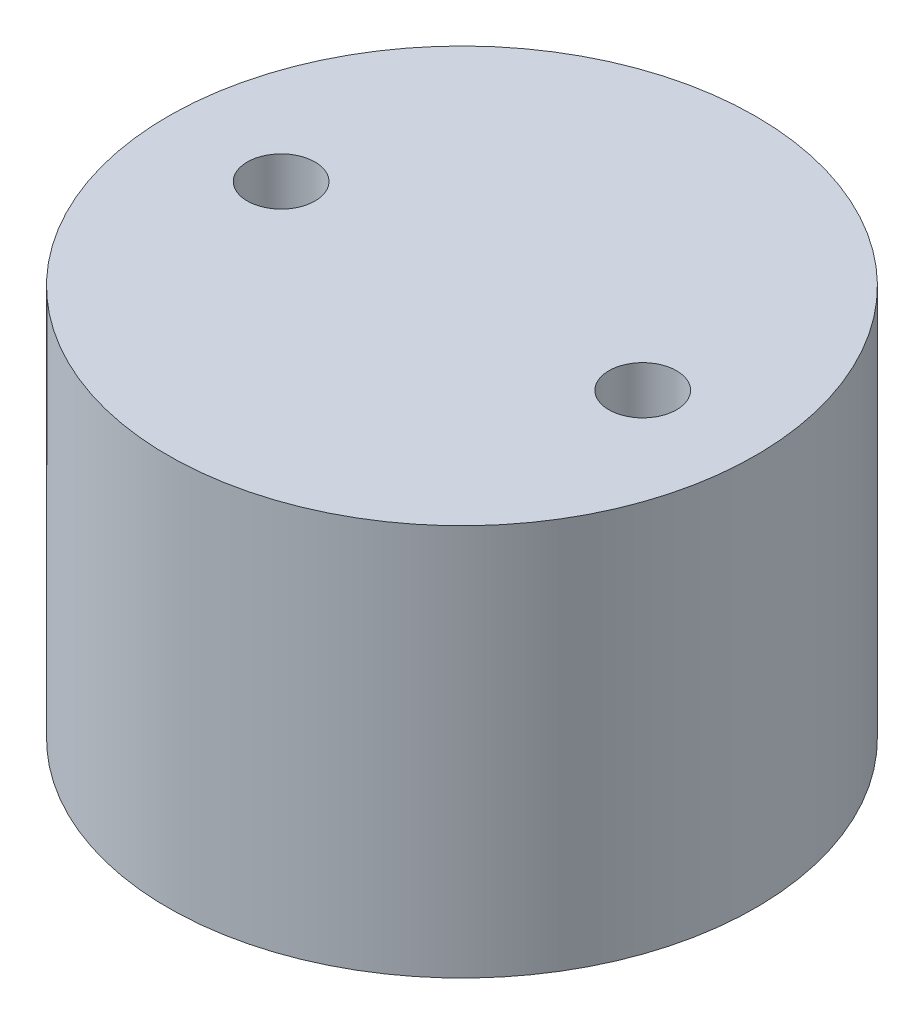
ISO-10303-21;
HEADER;
FILE_DESCRIPTION(('STEP AP214'),'2;1');
FILE_NAME('part.step','',(''),(''),'','','');
FILE_SCHEMA(('AUTOMOTIVE_DESIGN { 1 0 10303 214 1 1 1 1 }'));
ENDSEC;
DATA;
#1=APPLICATION_CONTEXT('core data for automotive mechanical design processes');
#2=APPLICATION_PROTOCOL_DEFINITION('international standard','automotive_design',2000,#1);
#3=PRODUCT_CONTEXT('',#1,'mechanical');
#4=PRODUCT('Part','Part','',(#3));
#5=PRODUCT_RELATED_PRODUCT_CATEGORY('part','',(#4));
#6=PRODUCT_DEFINITION_FORMATION('','',#4);
#7=PRODUCT_DEFINITION_CONTEXT('part definition',#1,'design');
#8=PRODUCT_DEFINITION('design','',#6,#7);
#9=PRODUCT_DEFINITION_SHAPE('','',#8);
#10=(LENGTH_UNIT() NAMED_UNIT(*) SI_UNIT(.MILLI.,.METRE.));
#11=(NAMED_UNIT(*) PLANE_ANGLE_UNIT() SI_UNIT($,.RADIAN.));
#12=(NAMED_UNIT(*) SI_UNIT($,.STERADIAN.) SOLID_ANGLE_UNIT());
#13=UNCERTAINTY_MEASURE_WITH_UNIT(LENGTH_MEASURE(1.E-05),#10,'distance_accuracy_value','');
#14=(GEOMETRIC_REPRESENTATION_CONTEXT(3) GLOBAL_UNCERTAINTY_ASSIGNED_CONTEXT((#13)) GLOBAL_UNIT_ASSIGNED_CONTEXT((#10,
#11,#12)) REPRESENTATION_CONTEXT('',''));
#15=CARTESIAN_POINT('',(0.,0.,0.));
#16=DIRECTION('',(0.,0.,1.));
#17=DIRECTION('',(1.,0.,0.));
#18=AXIS2_PLACEMENT_3D('',#15,#16,#17);
#19=CARTESIAN_POINT('',(0.,26.,0.));
#20=DIRECTION('',(0.,-1.,0.));
#21=DIRECTION('',(0.,0.,-1.));
#22=AXIS2_PLACEMENT_3D('',#19,#20,#21);
#23=CYLINDRICAL_SURFACE('',#22,19.5);
#24=CARTESIAN_POINT('',(0.,26.,0.));
#25=DIRECTION('',(0.,1.,0.));
#26=DIRECTION('',(0.,0.,1.));
#27=AXIS2_PLACEMENT_3D('',#24,#25,#26);
#28=CIRCLE('',#27,19.5);
#29=CARTESIAN_POINT('',(0.,26.,-19.5));
#30=VERTEX_POINT('',#29);
#31=EDGE_CURVE('E10',#30,#30,#28,.T.);
#32=CARTESIAN_POINT('',(0.,0.,0.));
#33=DIRECTION('',(0.,1.,0.));
#34=DIRECTION('',(0.,0.,1.));
#35=AXIS2_PLACEMENT_3D('',#32,#33,#34);
#36=CIRCLE('',#35,19.5);
#37=CARTESIAN_POINT('',(0.,0.,-19.5));
#38=VERTEX_POINT('',#37);
#39=EDGE_CURVE('E42',#38,#38,#36,.T.);
#40=CARTESIAN_POINT('',(0.,26.,-19.5));
#41=CARTESIAN_POINT('',(0.,25.7291666666667,-19.5));
#42=CARTESIAN_POINT('',(0.,25.4583333333333,-19.5));
#43=CARTESIAN_POINT('',(0.,24.9166666666667,-19.5));
#44=CARTESIAN_POINT('',(0.,24.6458333333333,-19.5));
#45=CARTESIAN_POINT('',(0.,24.1041666666667,-19.5));
#46=CARTESIAN_POINT('',(0.,23.8333333333333,-19.5));
#47=CARTESIAN_POINT('',(0.,23.2916666666667,-19.5));
#48=CARTESIAN_POINT('',(0.,23.0208333333333,-19.5));
#49=CARTESIAN_POINT('',(0.,22.4791666666667,-19.5));
#50=CARTESIAN_POINT('',(0.,22.2083333333333,-19.5));
#51=CARTESIAN_POINT('',(0.,21.6666666666667,-19.5));
#52=CARTESIAN_POINT('',(0.,21.3958333333333,-19.5));
#53=CARTESIAN_POINT('',(0.,20.8541666666667,-19.5));
#54=CARTESIAN_POINT('',(0.,20.5833333333333,-19.5));
#55=CARTESIAN_POINT('',(0.,20.0416666666667,-19.5));
#56=CARTESIAN_POINT('',(0.,19.7708333333333,-19.5));
#57=CARTESIAN_POINT('',(0.,19.2291666666667,-19.5));
#58=CARTESIAN_POINT('',(0.,18.9583333333333,-19.5));
#59=CARTESIAN_POINT('',(0.,18.4166666666667,-19.5));
#60=CARTESIAN_POINT('',(0.,18.1458333333333,-19.5));
#61=CARTESIAN_POINT('',(0.,17.6041666666667,-19.5));
#62=CARTESIAN_POINT('',(0.,17.3333333333333,-19.5));
#63=CARTESIAN_POINT('',(0.,16.7916666666667,-19.5));
#64=CARTESIAN_POINT('',(0.,16.5208333333333,-19.5));
#65=CARTESIAN_POINT('',(0.,15.9791666666667,-19.5));
#66=CARTESIAN_POINT('',(0.,15.7083333333333,-19.5));
#67=CARTESIAN_POINT('',(0.,15.1666666666667,-19.5));
#68=CARTESIAN_POINT('',(0.,14.8958333333333,-19.5));
#69=CARTESIAN_POINT('',(0.,14.3541666666667,-19.5));
#70=CARTESIAN_POINT('',(0.,14.0833333333333,-19.5));
#71=CARTESIAN_POINT('',(0.,13.5416666666667,-19.5));
#72=CARTESIAN_POINT('',(0.,13.2708333333333,-19.5));
#73=CARTESIAN_POINT('',(0.,12.7291666666667,-19.5));
#74=CARTESIAN_POINT('',(0.,12.4583333333333,-19.5));
#75=CARTESIAN_POINT('',(0.,11.9166666666667,-19.5));
#76=CARTESIAN_POINT('',(0.,11.6458333333333,-19.5));
#77=CARTESIAN_POINT('',(0.,11.1041666666667,-19.5));
#78=CARTESIAN_POINT('',(0.,10.8333333333333,-19.5));
#79=CARTESIAN_POINT('',(0.,10.2916666666667,-19.5));
#80=CARTESIAN_POINT('',(0.,10.0208333333333,-19.5));
#81=CARTESIAN_POINT('',(0.,9.47916666666667,-19.5));
#82=CARTESIAN_POINT('',(0.,9.20833333333333,-19.5));
#83=CARTESIAN_POINT('',(0.,8.66666666666667,-19.5));
#84=CARTESIAN_POINT('',(0.,8.39583333333333,-19.5));
#85=CARTESIAN_POINT('',(0.,7.85416666666667,-19.5));
#86=CARTESIAN_POINT('',(0.,7.58333333333333,-19.5));
#87=CARTESIAN_POINT('',(0.,7.04166666666667,-19.5));
#88=CARTESIAN_POINT('',(0.,6.77083333333333,-19.5));
#89=CARTESIAN_POINT('',(0.,6.22916666666667,-19.5));
#90=CARTESIAN_POINT('',(0.,5.95833333333333,-19.5));
#91=CARTESIAN_POINT('',(0.,5.41666666666667,-19.5));
#92=CARTESIAN_POINT('',(0.,5.14583333333333,-19.5));
#93=CARTESIAN_POINT('',(0.,4.60416666666667,-19.5));
#94=CARTESIAN_POINT('',(0.,4.33333333333333,-19.5));
#95=CARTESIAN_POINT('',(0.,3.79166666666667,-19.5));
#96=CARTESIAN_POINT('',(0.,3.52083333333333,-19.5));
#97=CARTESIAN_POINT('',(0.,2.97916666666667,-19.5));
#98=CARTESIAN_POINT('',(0.,2.70833333333333,-19.5));
#99=CARTESIAN_POINT('',(0.,2.16666666666667,-19.5));
#100=CARTESIAN_POINT('',(0.,1.89583333333333,-19.5));
#101=CARTESIAN_POINT('',(0.,1.35416666666667,-19.5));
#102=CARTESIAN_POINT('',(0.,1.08333333333333,-19.5));
#103=CARTESIAN_POINT('',(0.,0.541666666666667,-19.5));
#104=CARTESIAN_POINT('',(0.,0.270833333333334,-19.5));
#105=CARTESIAN_POINT('',(0.,0.,-19.5));
#106=B_SPLINE_CURVE_WITH_KNOTS('',3,(#40,#41,#42,#43,#44,#45,#46,#47,#48,#49,#50,#51,#52,#53,
#54,#55,#56,#57,#58,#59,#60,#61,#62,#63,#64,#65,#66,#67,#68,#69,#70,#71,#72,#73,#74,#75,#76,#77,
#78,#79,#80,#81,#82,#83,#84,#85,#86,#87,#88,#89,#90,#91,#92,#93,#94,#95,#96,#97,#98,#99,#100,
#101,#102,#103,#104,#105),.UNSPECIFIED.,.F.,.F.,(4,2,2,2,2,2,2,2,2,2,2,2,2,2,2,2,2,2,2,2,2,2,2,
2,2,2,2,2,2,2,2,2,4),(0.,0.812500000000001,1.625,2.4375,3.25,4.0625,4.875,5.6875,6.5,7.3125,
8.125,8.9375,9.75,10.5625,11.375,12.1875,13.,13.8125,14.625,15.4375,16.25,17.0625,17.875,
18.6875,19.5,20.3125,21.125,21.9375,22.75,23.5625,24.375,25.1875,26.),.UNSPECIFIED.);
#107=EDGE_CURVE('BSEAM39',#30,#38,#106,.T.);
#108=ORIENTED_EDGE('',*,*,#31,.F.);
#109=ORIENTED_EDGE('',*,*,#39,.T.);
#110=ORIENTED_EDGE('',*,*,#107,.T.);
#111=ORIENTED_EDGE('',*,*,#107,.F.);
#112=EDGE_LOOP('',(#108,#110,#109,#111));
#113=FACE_BOUND('',#112,.T.);
#114=ADVANCED_FACE('F39',(#113),#23,.T.);
#115=CARTESIAN_POINT('',(0.,26.,0.));
#116=DIRECTION('',(0.,1.,0.));
#117=DIRECTION('',(0.,0.,1.));
#118=AXIS2_PLACEMENT_3D('',#115,#116,#117);
#119=PLANE('',#118);
#120=CARTESIAN_POINT('',(12.,26.,0.));
#121=DIRECTION('',(0.,-1.,0.));
#122=DIRECTION('',(0.,0.,-1.));
#123=AXIS2_PLACEMENT_3D('',#120,#121,#122);
#124=CIRCLE('',#123,2.2479);
#125=CARTESIAN_POINT('',(12.,26.,-2.2479));
#126=VERTEX_POINT('',#125);
#127=EDGE_CURVE('E62',#126,#126,#124,.T.);
#128=ORIENTED_EDGE('',*,*,#127,.T.);
#129=EDGE_LOOP('',(#128));
#130=FACE_BOUND('',#129,.T.);
#131=CARTESIAN_POINT('',(-12.,26.,0.));
#132=DIRECTION('',(0.,-1.,0.));
#133=DIRECTION('',(0.,0.,-1.));
#134=AXIS2_PLACEMENT_3D('',#131,#132,#133);
#135=CIRCLE('',#134,2.2479);
#136=CARTESIAN_POINT('',(-12.,26.,-2.2479));
#137=VERTEX_POINT('',#136);
#138=EDGE_CURVE('E49',#137,#137,#135,.T.);
#139=ORIENTED_EDGE('',*,*,#138,.T.);
#140=EDGE_LOOP('',(#139));
#141=FACE_BOUND('',#140,.T.);
#142=ORIENTED_EDGE('',*,*,#31,.T.);
#143=EDGE_LOOP('',(#142));
#144=FACE_BOUND('',#143,.T.);
#145=ADVANCED_FACE('F81',(#130,#141,#144),#119,.T.);
#146=CARTESIAN_POINT('',(0.,0.,0.));
#147=DIRECTION('',(0.,1.,0.));
#148=DIRECTION('',(0.,0.,1.));
#149=AXIS2_PLACEMENT_3D('',#146,#147,#148);
#150=PLANE('',#149);
#151=CARTESIAN_POINT('',(12.,0.,0.));
#152=DIRECTION('',(0.,-1.,0.));
#153=DIRECTION('',(0.,0.,-1.));
#154=AXIS2_PLACEMENT_3D('',#151,#152,#153);
#155=CIRCLE('',#154,4.2164);
#156=CARTESIAN_POINT('',(12.,0.,-4.2164));
#157=VERTEX_POINT('',#156);
#158=EDGE_CURVE('E71',#157,#157,#155,.T.);
#159=ORIENTED_EDGE('',*,*,#158,.F.);
#160=EDGE_LOOP('',(#159));
#161=FACE_BOUND('',#160,.T.);
#162=CARTESIAN_POINT('',(-12.,0.,0.));
#163=DIRECTION('',(0.,-1.,0.));
#164=DIRECTION('',(0.,0.,-1.));
#165=AXIS2_PLACEMENT_3D('',#162,#163,#164);
#166=CIRCLE('',#165,4.2164);
#167=CARTESIAN_POINT('',(-12.,0.,-4.2164));
#168=VERTEX_POINT('',#167);
#169=EDGE_CURVE('E59',#168,#168,#166,.T.);
#170=ORIENTED_EDGE('',*,*,#169,.F.);
#171=EDGE_LOOP('',(#170));
#172=FACE_BOUND('',#171,.T.);
#173=ORIENTED_EDGE('',*,*,#39,.F.);
#174=EDGE_LOOP('',(#173));
#175=FACE_BOUND('',#174,.T.);
#176=ADVANCED_FACE('F77',(#161,#172,#175),#150,.F.);
#177=CARTESIAN_POINT('',(-12.,0.,0.));
#178=DIRECTION('',(0.,-1.,0.));
#179=DIRECTION('',(0.,0.,-1.));
#180=AXIS2_PLACEMENT_3D('',#177,#178,#179);
#181=CYLINDRICAL_SURFACE('',#180,2.2479);
#182=ORIENTED_EDGE('',*,*,#138,.F.);
#183=EDGE_LOOP('',(#182));
#184=FACE_BOUND('',#183,.T.);
#185=CARTESIAN_POINT('',(-12.,11.6517676239725,0.));
#186=DIRECTION('',(0.,-1.,0.));
#187=DIRECTION('',(0.,0.,-1.));
#188=AXIS2_PLACEMENT_3D('',#185,#186,#187);
#189=CIRCLE('',#188,2.2479);
#190=CARTESIAN_POINT('',(-12.,11.6517676239725,-2.2479));
#191=VERTEX_POINT('',#190);
#192=EDGE_CURVE('E53',#191,#191,#189,.T.);
#193=ORIENTED_EDGE('',*,*,#192,.T.);
#194=EDGE_LOOP('',(#193));
#195=FACE_BOUND('',#194,.T.);
#196=ADVANCED_FACE('F80',(#184,#195),#181,.F.);
#197=CARTESIAN_POINT('',(-12.,10.,0.));
#198=DIRECTION('',(0.,-1.,0.));
#199=DIRECTION('',(0.,0.,-1.));
#200=AXIS2_PLACEMENT_3D('',#197,#198,#199);
#201=CONICAL_SURFACE('',#200,4.2164,0.872664625997165);
#202=ORIENTED_EDGE('',*,*,#192,.F.);
#203=EDGE_LOOP('',(#202));
#204=FACE_BOUND('',#203,.T.);
#205=CARTESIAN_POINT('',(-12.,10.,0.));
#206=DIRECTION('',(0.,-1.,0.));
#207=DIRECTION('',(0.,0.,-1.));
#208=AXIS2_PLACEMENT_3D('',#205,#206,#207);
#209=CIRCLE('',#208,4.2164);
#210=CARTESIAN_POINT('',(-12.,10.,-4.2164));
#211=VERTEX_POINT('',#210);
#212=EDGE_CURVE('E56',#211,#211,#209,.T.);
#213=ORIENTED_EDGE('',*,*,#212,.T.);
#214=EDGE_LOOP('',(#213));
#215=FACE_BOUND('',#214,.T.);
#216=ADVANCED_FACE('F99',(#204,#215),#201,.F.);
#217=CARTESIAN_POINT('',(-12.,0.,0.));
#218=DIRECTION('',(0.,-1.,0.));
#219=DIRECTION('',(0.,0.,-1.));
#220=AXIS2_PLACEMENT_3D('',#217,#218,#219);
#221=CYLINDRICAL_SURFACE('',#220,4.2164);
#222=ORIENTED_EDGE('',*,*,#212,.F.);
#223=EDGE_LOOP('',(#222));
#224=FACE_BOUND('',#223,.T.);
#225=ORIENTED_EDGE('',*,*,#169,.T.);
#226=EDGE_LOOP('',(#225));
#227=FACE_BOUND('',#226,.T.);
#228=ADVANCED_FACE('F103',(#224,#227),#221,.F.);
#229=CARTESIAN_POINT('',(12.,0.,0.));
#230=DIRECTION('',(0.,-1.,0.));
#231=DIRECTION('',(0.,0.,-1.));
#232=AXIS2_PLACEMENT_3D('',#229,#230,#231);
#233=CYLINDRICAL_SURFACE('',#232,2.2479);
#234=ORIENTED_EDGE('',*,*,#127,.F.);
#235=EDGE_LOOP('',(#234));
#236=FACE_BOUND('',#235,.T.);
#237=CARTESIAN_POINT('',(12.,11.6517676239725,0.));
#238=DIRECTION('',(0.,-1.,0.));
#239=DIRECTION('',(0.,0.,-1.));
#240=AXIS2_PLACEMENT_3D('',#237,#238,#239);
#241=CIRCLE('',#240,2.2479);
#242=CARTESIAN_POINT('',(12.,11.6517676239725,-2.2479));
#243=VERTEX_POINT('',#242);
#244=EDGE_CURVE('E65',#243,#243,#241,.T.);
#245=ORIENTED_EDGE('',*,*,#244,.T.);
#246=EDGE_LOOP('',(#245));
#247=FACE_BOUND('',#246,.T.);
#248=ADVANCED_FACE('F107',(#236,#247),#233,.F.);
#249=CARTESIAN_POINT('',(12.,10.,0.));
#250=DIRECTION('',(0.,-1.,0.));
#251=DIRECTION('',(0.,0.,-1.));
#252=AXIS2_PLACEMENT_3D('',#249,#250,#251);
#253=CONICAL_SURFACE('',#252,4.21639999999999,0.872664625997164);
#254=ORIENTED_EDGE('',*,*,#244,.F.);
#255=EDGE_LOOP('',(#254));
#256=FACE_BOUND('',#255,.T.);
#257=CARTESIAN_POINT('',(12.,10.,0.));
#258=DIRECTION('',(0.,-1.,0.));
#259=DIRECTION('',(0.,0.,-1.));
#260=AXIS2_PLACEMENT_3D('',#257,#258,#259);
#261=CIRCLE('',#260,4.21639999999999);
#262=CARTESIAN_POINT('',(12.,10.,-4.21639999999999));
#263=VERTEX_POINT('',#262);
#264=EDGE_CURVE('E68',#263,#263,#261,.T.);
#265=ORIENTED_EDGE('',*,*,#264,.T.);
#266=EDGE_LOOP('',(#265));
#267=FACE_BOUND('',#266,.T.);
#268=ADVANCED_FACE('F111',(#256,#267),#253,.F.);
#269=CARTESIAN_POINT('',(12.,0.,0.));
#270=DIRECTION('',(0.,-1.,0.));
#271=DIRECTION('',(0.,0.,-1.));
#272=AXIS2_PLACEMENT_3D('',#269,#270,#271);
#273=CYLINDRICAL_SURFACE('',#272,4.2164);
#274=ORIENTED_EDGE('',*,*,#264,.F.);
#275=EDGE_LOOP('',(#274));
#276=FACE_BOUND('',#275,.T.);
#277=ORIENTED_EDGE('',*,*,#158,.T.);
#278=EDGE_LOOP('',(#277));
#279=FACE_BOUND('',#278,.T.);
#280=ADVANCED_FACE('F75',(#276,#279),#273,.F.);
#281=CLOSED_SHELL('',(#114,#145,#176,#196,#216,#228,#248,#268,#280));
#282=MANIFOLD_SOLID_BREP('B2',#281);
#283=ADVANCED_BREP_SHAPE_REPRESENTATION('',(#18,#282),#14);
#284=SHAPE_DEFINITION_REPRESENTATION(#9,#283);
ENDSEC;
END-ISO-10303-21;
